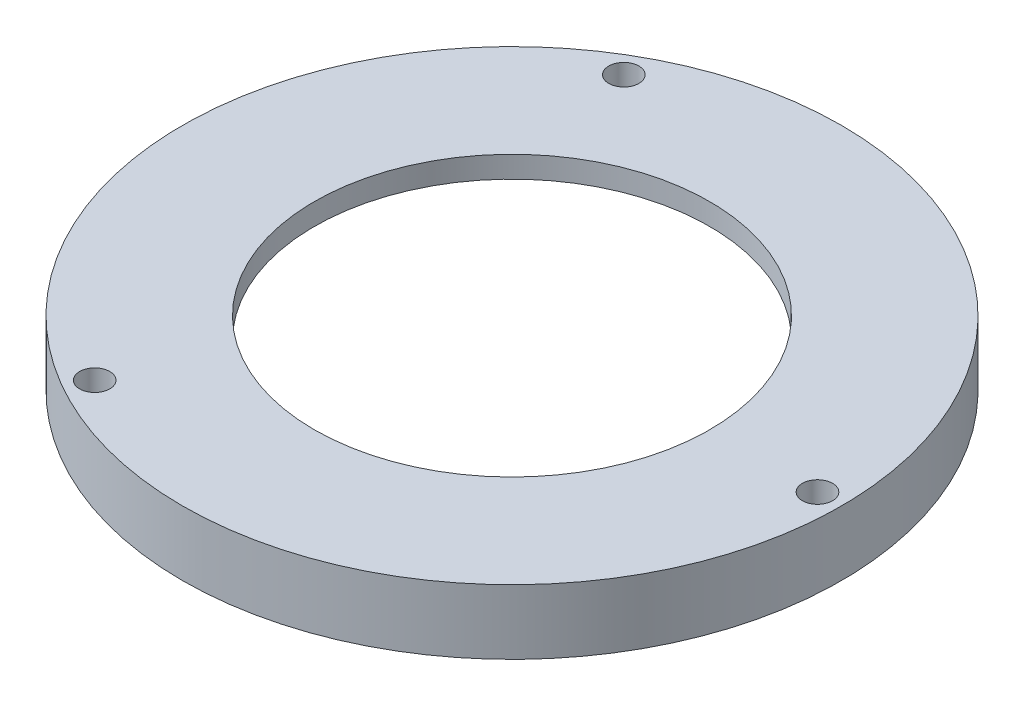
ISO-10303-21;
HEADER;
FILE_DESCRIPTION(('STEP AP214'),'2;1');
FILE_NAME('part.step','',(''),(''),'','','');
FILE_SCHEMA(('AUTOMOTIVE_DESIGN { 1 0 10303 214 1 1 1 1 }'));
ENDSEC;
DATA;
#1=APPLICATION_CONTEXT('core data for automotive mechanical design processes');
#2=APPLICATION_PROTOCOL_DEFINITION('international standard','automotive_design',2000,#1);
#3=PRODUCT_CONTEXT('',#1,'mechanical');
#4=PRODUCT('Part','Part','',(#3));
#5=PRODUCT_RELATED_PRODUCT_CATEGORY('part','',(#4));
#6=PRODUCT_DEFINITION_FORMATION('','',#4);
#7=PRODUCT_DEFINITION_CONTEXT('part definition',#1,'design');
#8=PRODUCT_DEFINITION('design','',#6,#7);
#9=PRODUCT_DEFINITION_SHAPE('','',#8);
#10=(LENGTH_UNIT() NAMED_UNIT(*) SI_UNIT(.MILLI.,.METRE.));
#11=(NAMED_UNIT(*) PLANE_ANGLE_UNIT() SI_UNIT($,.RADIAN.));
#12=(NAMED_UNIT(*) SI_UNIT($,.STERADIAN.) SOLID_ANGLE_UNIT());
#13=UNCERTAINTY_MEASURE_WITH_UNIT(LENGTH_MEASURE(1.E-05),#10,'distance_accuracy_value','');
#14=(GEOMETRIC_REPRESENTATION_CONTEXT(3) GLOBAL_UNCERTAINTY_ASSIGNED_CONTEXT((#13)) GLOBAL_UNIT_ASSIGNED_CONTEXT((#10,
#11,#12)) REPRESENTATION_CONTEXT('',''));
#15=CARTESIAN_POINT('',(0.,0.,0.));
#16=DIRECTION('',(0.,0.,1.));
#17=DIRECTION('',(1.,0.,0.));
#18=AXIS2_PLACEMENT_3D('',#15,#16,#17);
#19=CARTESIAN_POINT('',(-21.25,-6.,36.8060796608387));
#20=DIRECTION('',(0.,1.,0.));
#21=DIRECTION('',(0.,0.,1.));
#22=AXIS2_PLACEMENT_3D('',#19,#20,#21);
#23=CYLINDRICAL_SURFACE('',#22,2.09999999999999);
#24=CARTESIAN_POINT('',(-21.25,-6.,36.8060796608387));
#25=DIRECTION('',(0.,1.,0.));
#26=DIRECTION('',(0.,0.,1.));
#27=AXIS2_PLACEMENT_3D('',#24,#25,#26);
#28=CIRCLE('',#27,2.09999999999999);
#29=CARTESIAN_POINT('',(-21.25,-6.,38.9060796608386));
#30=VERTEX_POINT('',#29);
#31=EDGE_CURVE('E50',#30,#30,#28,.T.);
#32=ORIENTED_EDGE('',*,*,#31,.F.);
#33=EDGE_LOOP('',(#32));
#34=FACE_BOUND('',#33,.T.);
#35=CARTESIAN_POINT('',(-21.25,3.,36.8060796608387));
#36=DIRECTION('',(0.,1.,0.));
#37=DIRECTION('',(0.,0.,1.));
#38=AXIS2_PLACEMENT_3D('',#35,#36,#37);
#39=CIRCLE('',#38,2.09999999999999);
#40=CARTESIAN_POINT('',(-21.25,3.,38.9060796608386));
#41=VERTEX_POINT('',#40);
#42=EDGE_CURVE('E78',#41,#41,#39,.T.);
#43=ORIENTED_EDGE('',*,*,#42,.T.);
#44=EDGE_LOOP('',(#43));
#45=FACE_BOUND('',#44,.T.);
#46=ADVANCED_FACE('F41',(#34,#45),#23,.F.);
#47=CARTESIAN_POINT('',(-21.25,-6.,-36.8060796608386));
#48=DIRECTION('',(0.,1.,0.));
#49=DIRECTION('',(0.,0.,1.));
#50=AXIS2_PLACEMENT_3D('',#47,#48,#49);
#51=CYLINDRICAL_SURFACE('',#50,2.09999999999998);
#52=CARTESIAN_POINT('',(-21.25,-6.,-36.8060796608386));
#53=DIRECTION('',(0.,1.,0.));
#54=DIRECTION('',(0.,0.,1.));
#55=AXIS2_PLACEMENT_3D('',#52,#53,#54);
#56=CIRCLE('',#55,2.09999999999998);
#57=CARTESIAN_POINT('',(-21.25,-6.,-34.7060796608387));
#58=VERTEX_POINT('',#57);
#59=EDGE_CURVE('E55',#58,#58,#56,.T.);
#60=ORIENTED_EDGE('',*,*,#59,.F.);
#61=EDGE_LOOP('',(#60));
#62=FACE_BOUND('',#61,.T.);
#63=CARTESIAN_POINT('',(-21.25,3.,-36.8060796608386));
#64=DIRECTION('',(0.,1.,0.));
#65=DIRECTION('',(0.,0.,1.));
#66=AXIS2_PLACEMENT_3D('',#63,#64,#65);
#67=CIRCLE('',#66,2.09999999999998);
#68=CARTESIAN_POINT('',(-21.25,3.,-34.7060796608387));
#69=VERTEX_POINT('',#68);
#70=EDGE_CURVE('E82',#69,#69,#67,.T.);
#71=ORIENTED_EDGE('',*,*,#70,.T.);
#72=EDGE_LOOP('',(#71));
#73=FACE_BOUND('',#72,.T.);
#74=ADVANCED_FACE('F124',(#62,#73),#51,.F.);
#75=CARTESIAN_POINT('',(0.,-6.,0.));
#76=DIRECTION('',(0.,1.,0.));
#77=DIRECTION('',(0.,0.,1.));
#78=AXIS2_PLACEMENT_3D('',#75,#76,#77);
#79=CYLINDRICAL_SURFACE('',#78,39.3);
#80=CARTESIAN_POINT('',(0.,-6.,0.));
#81=DIRECTION('',(0.,1.,0.));
#82=DIRECTION('',(0.,0.,1.));
#83=AXIS2_PLACEMENT_3D('',#80,#81,#82);
#84=CIRCLE('',#83,39.3);
#85=CARTESIAN_POINT('',(0.,-6.,39.3));
#86=VERTEX_POINT('',#85);
#87=EDGE_CURVE('E61',#86,#86,#84,.T.);
#88=ORIENTED_EDGE('',*,*,#87,.F.);
#89=EDGE_LOOP('',(#88));
#90=FACE_BOUND('',#89,.T.);
#91=CARTESIAN_POINT('',(0.,0.,0.));
#92=DIRECTION('',(0.,1.,0.));
#93=DIRECTION('',(0.,0.,1.));
#94=AXIS2_PLACEMENT_3D('',#91,#92,#93);
#95=CIRCLE('',#94,39.3);
#96=CARTESIAN_POINT('',(0.,0.,39.3));
#97=VERTEX_POINT('',#96);
#98=EDGE_CURVE('E45',#97,#97,#95,.T.);
#99=ORIENTED_EDGE('',*,*,#98,.T.);
#100=EDGE_LOOP('',(#99));
#101=FACE_BOUND('',#100,.T.);
#102=ADVANCED_FACE('F120',(#90,#101),#79,.F.);
#103=CARTESIAN_POINT('',(42.5,-6.,0.));
#104=DIRECTION('',(0.,1.,0.));
#105=DIRECTION('',(0.,0.,1.));
#106=AXIS2_PLACEMENT_3D('',#103,#104,#105);
#107=CYLINDRICAL_SURFACE('',#106,2.09999999999999);
#108=CARTESIAN_POINT('',(42.5,-6.,0.));
#109=DIRECTION('',(0.,1.,0.));
#110=DIRECTION('',(0.,0.,1.));
#111=AXIS2_PLACEMENT_3D('',#108,#109,#110);
#112=CIRCLE('',#111,2.09999999999999);
#113=CARTESIAN_POINT('',(42.5,-6.,2.09999999999999));
#114=VERTEX_POINT('',#113);
#115=EDGE_CURVE('E65',#114,#114,#112,.T.);
#116=ORIENTED_EDGE('',*,*,#115,.F.);
#117=EDGE_LOOP('',(#116));
#118=FACE_BOUND('',#117,.T.);
#119=CARTESIAN_POINT('',(42.5,3.,0.));
#120=DIRECTION('',(0.,1.,0.));
#121=DIRECTION('',(0.,0.,1.));
#122=AXIS2_PLACEMENT_3D('',#119,#120,#121);
#123=CIRCLE('',#122,2.09999999999999);
#124=CARTESIAN_POINT('',(42.5,3.,2.09999999999999));
#125=VERTEX_POINT('',#124);
#126=EDGE_CURVE('E86',#125,#125,#123,.T.);
#127=ORIENTED_EDGE('',*,*,#126,.T.);
#128=EDGE_LOOP('',(#127));
#129=FACE_BOUND('',#128,.T.);
#130=ADVANCED_FACE('F43',(#118,#129),#107,.F.);
#131=CARTESIAN_POINT('',(0.,-6.,0.));
#132=DIRECTION('',(0.,1.,0.));
#133=DIRECTION('',(0.,0.,1.));
#134=AXIS2_PLACEMENT_3D('',#131,#132,#133);
#135=CYLINDRICAL_SURFACE('',#134,45.85);
#136=CARTESIAN_POINT('',(0.,-6.,0.));
#137=DIRECTION('',(0.,1.,0.));
#138=DIRECTION('',(0.,0.,1.));
#139=AXIS2_PLACEMENT_3D('',#136,#137,#138);
#140=CIRCLE('',#139,45.85);
#141=CARTESIAN_POINT('',(0.,-6.,45.85));
#142=VERTEX_POINT('',#141);
#143=EDGE_CURVE('E10',#142,#142,#140,.T.);
#144=ORIENTED_EDGE('',*,*,#143,.T.);
#145=EDGE_LOOP('',(#144));
#146=FACE_BOUND('',#145,.T.);
#147=CARTESIAN_POINT('',(0.,3.,0.));
#148=DIRECTION('',(0.,1.,0.));
#149=DIRECTION('',(0.,0.,1.));
#150=AXIS2_PLACEMENT_3D('',#147,#148,#149);
#151=CIRCLE('',#150,45.85);
#152=CARTESIAN_POINT('',(0.,3.,45.85));
#153=VERTEX_POINT('',#152);
#154=EDGE_CURVE('E74',#153,#153,#151,.T.);
#155=ORIENTED_EDGE('',*,*,#154,.F.);
#156=EDGE_LOOP('',(#155));
#157=FACE_BOUND('',#156,.T.);
#158=ADVANCED_FACE('F109',(#146,#157),#135,.T.);
#159=CARTESIAN_POINT('',(0.,-6.,0.));
#160=DIRECTION('',(0.,1.,0.));
#161=DIRECTION('',(0.,0.,1.));
#162=AXIS2_PLACEMENT_3D('',#159,#160,#161);
#163=PLANE('',#162);
#164=ORIENTED_EDGE('',*,*,#115,.T.);
#165=EDGE_LOOP('',(#164));
#166=FACE_BOUND('',#165,.T.);
#167=ORIENTED_EDGE('',*,*,#87,.T.);
#168=EDGE_LOOP('',(#167));
#169=FACE_BOUND('',#168,.T.);
#170=ORIENTED_EDGE('',*,*,#59,.T.);
#171=EDGE_LOOP('',(#170));
#172=FACE_BOUND('',#171,.T.);
#173=ORIENTED_EDGE('',*,*,#31,.T.);
#174=EDGE_LOOP('',(#173));
#175=FACE_BOUND('',#174,.T.);
#176=ORIENTED_EDGE('',*,*,#143,.F.);
#177=EDGE_LOOP('',(#176));
#178=FACE_BOUND('',#177,.T.);
#179=ADVANCED_FACE('F111',(#166,#169,#172,#175,#178),#163,.F.);
#180=CARTESIAN_POINT('',(0.,0.,0.));
#181=DIRECTION('',(0.,1.,0.));
#182=DIRECTION('',(0.,0.,1.));
#183=AXIS2_PLACEMENT_3D('',#180,#181,#182);
#184=PLANE('',#183);
#185=CARTESIAN_POINT('',(0.,0.,0.));
#186=DIRECTION('',(0.,1.,0.));
#187=DIRECTION('',(0.,0.,1.));
#188=AXIS2_PLACEMENT_3D('',#185,#186,#187);
#189=CIRCLE('',#188,27.5);
#190=CARTESIAN_POINT('',(0.,0.,27.5));
#191=VERTEX_POINT('',#190);
#192=EDGE_CURVE('E69',#191,#191,#189,.T.);
#193=ORIENTED_EDGE('',*,*,#192,.T.);
#194=EDGE_LOOP('',(#193));
#195=FACE_BOUND('',#194,.T.);
#196=ORIENTED_EDGE('',*,*,#98,.F.);
#197=EDGE_LOOP('',(#196));
#198=FACE_BOUND('',#197,.T.);
#199=ADVANCED_FACE('F117',(#195,#198),#184,.F.);
#200=CARTESIAN_POINT('',(0.,3.,0.));
#201=DIRECTION('',(0.,-1.,0.));
#202=DIRECTION('',(0.,0.,-1.));
#203=AXIS2_PLACEMENT_3D('',#200,#201,#202);
#204=CYLINDRICAL_SURFACE('',#203,27.5);
#205=CARTESIAN_POINT('',(0.,3.,0.));
#206=DIRECTION('',(0.,1.,0.));
#207=DIRECTION('',(0.,0.,1.));
#208=AXIS2_PLACEMENT_3D('',#205,#206,#207);
#209=CIRCLE('',#208,27.5);
#210=CARTESIAN_POINT('',(0.,3.,27.5));
#211=VERTEX_POINT('',#210);
#212=EDGE_CURVE('E73',#211,#211,#209,.T.);
#213=ORIENTED_EDGE('',*,*,#212,.T.);
#214=EDGE_LOOP('',(#213));
#215=FACE_BOUND('',#214,.T.);
#216=ORIENTED_EDGE('',*,*,#192,.F.);
#217=EDGE_LOOP('',(#216));
#218=FACE_BOUND('',#217,.T.);
#219=ADVANCED_FACE('F94',(#215,#218),#204,.F.);
#220=CARTESIAN_POINT('',(0.,3.,0.));
#221=DIRECTION('',(0.,1.,0.));
#222=DIRECTION('',(0.,0.,1.));
#223=AXIS2_PLACEMENT_3D('',#220,#221,#222);
#224=PLANE('',#223);
#225=ORIENTED_EDGE('',*,*,#212,.F.);
#226=EDGE_LOOP('',(#225));
#227=FACE_BOUND('',#226,.T.);
#228=ORIENTED_EDGE('',*,*,#126,.F.);
#229=EDGE_LOOP('',(#228));
#230=FACE_BOUND('',#229,.T.);
#231=ORIENTED_EDGE('',*,*,#70,.F.);
#232=EDGE_LOOP('',(#231));
#233=FACE_BOUND('',#232,.T.);
#234=ORIENTED_EDGE('',*,*,#42,.F.);
#235=EDGE_LOOP('',(#234));
#236=FACE_BOUND('',#235,.T.);
#237=ORIENTED_EDGE('',*,*,#154,.T.);
#238=EDGE_LOOP('',(#237));
#239=FACE_BOUND('',#238,.T.);
#240=ADVANCED_FACE('F97',(#227,#230,#233,#236,#239),#224,.T.);
#241=CLOSED_SHELL('',(#46,#74,#102,#130,#158,#179,#199,#219,#240));
#242=MANIFOLD_SOLID_BREP('B2',#241);
#243=ADVANCED_BREP_SHAPE_REPRESENTATION('',(#18,#242),#14);
#244=SHAPE_DEFINITION_REPRESENTATION(#9,#243);
ENDSEC;
END-ISO-10303-21;
